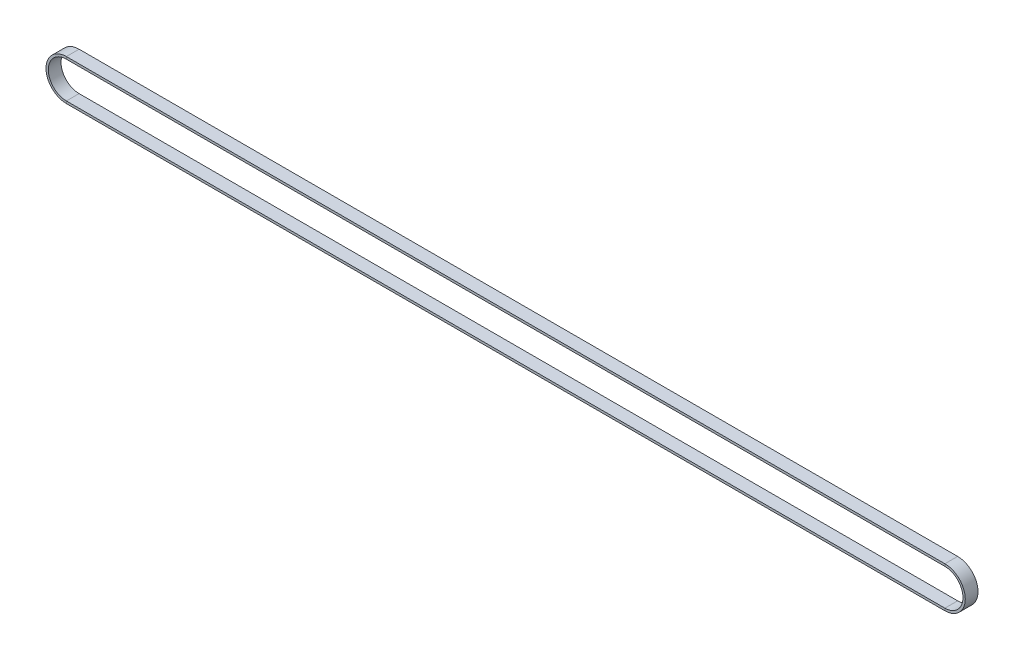
ISO-10303-21;
HEADER;
FILE_DESCRIPTION(('STEP AP214'),'2;1');
FILE_NAME('part.step','',(''),(''),'','','');
FILE_SCHEMA(('AUTOMOTIVE_DESIGN { 1 0 10303 214 1 1 1 1 }'));
ENDSEC;
DATA;
#1=APPLICATION_CONTEXT('core data for automotive mechanical design processes');
#2=APPLICATION_PROTOCOL_DEFINITION('international standard','automotive_design',2000,#1);
#3=PRODUCT_CONTEXT('',#1,'mechanical');
#4=PRODUCT('Part','Part','',(#3));
#5=PRODUCT_RELATED_PRODUCT_CATEGORY('part','',(#4));
#6=PRODUCT_DEFINITION_FORMATION('','',#4);
#7=PRODUCT_DEFINITION_CONTEXT('part definition',#1,'design');
#8=PRODUCT_DEFINITION('design','',#6,#7);
#9=PRODUCT_DEFINITION_SHAPE('','',#8);
#10=(LENGTH_UNIT() NAMED_UNIT(*) SI_UNIT(.MILLI.,.METRE.));
#11=(NAMED_UNIT(*) PLANE_ANGLE_UNIT() SI_UNIT($,.RADIAN.));
#12=(NAMED_UNIT(*) SI_UNIT($,.STERADIAN.) SOLID_ANGLE_UNIT());
#13=UNCERTAINTY_MEASURE_WITH_UNIT(LENGTH_MEASURE(1.E-05),#10,'distance_accuracy_value','');
#14=(GEOMETRIC_REPRESENTATION_CONTEXT(3) GLOBAL_UNCERTAINTY_ASSIGNED_CONTEXT((#13)) GLOBAL_UNIT_ASSIGNED_CONTEXT((#10,
#11,#12)) REPRESENTATION_CONTEXT('',''));
#15=CARTESIAN_POINT('',(0.,0.,0.));
#16=DIRECTION('',(0.,0.,1.));
#17=DIRECTION('',(1.,0.,0.));
#18=AXIS2_PLACEMENT_3D('',#15,#16,#17);
#19=CARTESIAN_POINT('',(438.15,10.1600000000001,-3.175));
#20=DIRECTION('',(0.,-1.,0.));
#21=DIRECTION('',(0.,0.,-1.));
#22=AXIS2_PLACEMENT_3D('',#19,#20,#21);
#23=PLANE('',#22);
#24=DIRECTION('',(0.,0.,1.));
#25=VECTOR('',#24,1.);
#26=CARTESIAN_POINT('',(438.15,10.16,-3.175));
#27=LINE('',#26,#25);
#28=CARTESIAN_POINT('',(438.15,10.16,-3.175));
#29=VERTEX_POINT('',#28);
#30=CARTESIAN_POINT('',(438.15,10.16,3.175));
#31=VERTEX_POINT('',#30);
#32=EDGE_CURVE('E155',#29,#31,#27,.T.);
#33=ORIENTED_EDGE('',*,*,#32,.F.);
#34=DIRECTION('',(-1.,0.,0.));
#35=VECTOR('',#34,1.);
#36=CARTESIAN_POINT('',(438.15,10.1600000000001,-3.175));
#37=LINE('',#36,#35);
#38=CARTESIAN_POINT('',(0.,10.16,-3.175));
#39=VERTEX_POINT('',#38);
#40=EDGE_CURVE('E154',#29,#39,#37,.T.);
#41=ORIENTED_EDGE('',*,*,#40,.T.);
#42=DIRECTION('',(0.,0.,1.));
#43=VECTOR('',#42,1.);
#44=CARTESIAN_POINT('',(0.,10.16,-3.175));
#45=LINE('',#44,#43);
#46=CARTESIAN_POINT('',(0.,10.16,3.175));
#47=VERTEX_POINT('',#46);
#48=EDGE_CURVE('E133',#39,#47,#45,.T.);
#49=ORIENTED_EDGE('',*,*,#48,.T.);
#50=DIRECTION('',(-1.,0.,0.));
#51=VECTOR('',#50,1.);
#52=CARTESIAN_POINT('',(438.15,10.1600000000001,3.175));
#53=LINE('',#52,#51);
#54=EDGE_CURVE('E159',#31,#47,#53,.T.);
#55=ORIENTED_EDGE('',*,*,#54,.F.);
#56=EDGE_LOOP('',(#33,#41,#49,#55));
#57=FACE_BOUND('',#56,.T.);
#58=ADVANCED_FACE('F39',(#57),#23,.F.);
#59=CARTESIAN_POINT('',(0.,0.,0.));
#60=DIRECTION('',(0.,0.,1.));
#61=DIRECTION('',(1.,0.,0.));
#62=AXIS2_PLACEMENT_3D('',#59,#60,#61);
#63=CYLINDRICAL_SURFACE('',#62,10.16);
#64=CARTESIAN_POINT('',(0.,0.,3.175));
#65=DIRECTION('',(0.,0.,1.));
#66=DIRECTION('',(0.,1.,0.));
#67=AXIS2_PLACEMENT_3D('',#64,#65,#66);
#68=CIRCLE('',#67,10.16);
#69=CARTESIAN_POINT('',(0.,-10.16,3.175));
#70=VERTEX_POINT('',#69);
#71=EDGE_CURVE('E123',#47,#70,#68,.T.);
#72=ORIENTED_EDGE('',*,*,#71,.F.);
#73=ORIENTED_EDGE('',*,*,#48,.F.);
#74=CARTESIAN_POINT('',(0.,0.,-3.175));
#75=DIRECTION('',(0.,0.,1.));
#76=DIRECTION('',(0.,1.,0.));
#77=AXIS2_PLACEMENT_3D('',#74,#75,#76);
#78=CIRCLE('',#77,10.16);
#79=CARTESIAN_POINT('',(0.,-10.16,-3.175));
#80=VERTEX_POINT('',#79);
#81=EDGE_CURVE('E136',#39,#80,#78,.T.);
#82=ORIENTED_EDGE('',*,*,#81,.T.);
#83=DIRECTION('',(0.,0.,1.));
#84=VECTOR('',#83,1.);
#85=CARTESIAN_POINT('',(0.,-10.16,-3.175));
#86=LINE('',#85,#84);
#87=EDGE_CURVE('E151',#80,#70,#86,.T.);
#88=ORIENTED_EDGE('',*,*,#87,.T.);
#89=EDGE_LOOP('',(#72,#73,#82,#88));
#90=FACE_BOUND('',#89,.T.);
#91=ADVANCED_FACE('F135',(#90),#63,.T.);
#92=CARTESIAN_POINT('',(0.,9.017,3.175));
#93=DIRECTION('',(0.,0.,-1.));
#94=DIRECTION('',(-1.,0.,0.));
#95=AXIS2_PLACEMENT_3D('',#92,#93,#94);
#96=PLANE('',#95);
#97=CARTESIAN_POINT('',(0.,0.,3.175));
#98=DIRECTION('',(0.,0.,1.));
#99=DIRECTION('',(0.,1.,0.));
#100=AXIS2_PLACEMENT_3D('',#97,#98,#99);
#101=CIRCLE('',#100,9.017);
#102=CARTESIAN_POINT('',(0.,9.017,3.175));
#103=VERTEX_POINT('',#102);
#104=CARTESIAN_POINT('',(0.,-9.017,3.175));
#105=VERTEX_POINT('',#104);
#106=EDGE_CURVE('E117',#103,#105,#101,.T.);
#107=ORIENTED_EDGE('',*,*,#106,.F.);
#108=DIRECTION('',(0.,-1.,0.));
#109=VECTOR('',#108,1.);
#110=CARTESIAN_POINT('',(0.,9.017,3.175));
#111=LINE('',#110,#109);
#112=EDGE_CURVE('E141',#47,#103,#111,.T.);
#113=ORIENTED_EDGE('',*,*,#112,.F.);
#114=ORIENTED_EDGE('',*,*,#71,.T.);
#115=DIRECTION('',(0.,1.,0.));
#116=VECTOR('',#115,1.);
#117=CARTESIAN_POINT('',(0.,-9.017,3.175));
#118=LINE('',#117,#116);
#119=EDGE_CURVE('E199',#70,#105,#118,.T.);
#120=ORIENTED_EDGE('',*,*,#119,.T.);
#121=EDGE_LOOP('',(#107,#113,#114,#120));
#122=FACE_BOUND('',#121,.T.);
#123=ADVANCED_FACE('F218',(#122),#96,.F.);
#124=CARTESIAN_POINT('',(0.,0.,0.));
#125=DIRECTION('',(0.,0.,1.));
#126=DIRECTION('',(1.,0.,0.));
#127=AXIS2_PLACEMENT_3D('',#124,#125,#126);
#128=CYLINDRICAL_SURFACE('',#127,9.017);
#129=CARTESIAN_POINT('',(0.,0.,-3.175));
#130=DIRECTION('',(0.,0.,1.));
#131=DIRECTION('',(0.,1.,0.));
#132=AXIS2_PLACEMENT_3D('',#129,#130,#131);
#133=CIRCLE('',#132,9.017);
#134=CARTESIAN_POINT('',(0.,9.017,-3.175));
#135=VERTEX_POINT('',#134);
#136=CARTESIAN_POINT('',(0.,-9.017,-3.175));
#137=VERTEX_POINT('',#136);
#138=EDGE_CURVE('E169',#135,#137,#133,.T.);
#139=ORIENTED_EDGE('',*,*,#138,.F.);
#140=DIRECTION('',(0.,0.,-1.));
#141=VECTOR('',#140,1.);
#142=CARTESIAN_POINT('',(0.,9.017,3.175));
#143=LINE('',#142,#141);
#144=EDGE_CURVE('E162',#103,#135,#143,.T.);
#145=ORIENTED_EDGE('',*,*,#144,.F.);
#146=ORIENTED_EDGE('',*,*,#106,.T.);
#147=DIRECTION('',(0.,0.,-1.));
#148=VECTOR('',#147,1.);
#149=CARTESIAN_POINT('',(0.,-9.017,3.175));
#150=LINE('',#149,#148);
#151=EDGE_CURVE('E187',#105,#137,#150,.T.);
#152=ORIENTED_EDGE('',*,*,#151,.T.);
#153=EDGE_LOOP('',(#139,#145,#146,#152));
#154=FACE_BOUND('',#153,.T.);
#155=ADVANCED_FACE('F186',(#154),#128,.F.);
#156=CARTESIAN_POINT('',(0.,9.017,-3.175));
#157=DIRECTION('',(0.,0.,1.));
#158=DIRECTION('',(1.,0.,0.));
#159=AXIS2_PLACEMENT_3D('',#156,#157,#158);
#160=PLANE('',#159);
#161=DIRECTION('',(0.,-1.,0.));
#162=VECTOR('',#161,1.);
#163=CARTESIAN_POINT('',(0.,-9.017,-3.175));
#164=LINE('',#163,#162);
#165=EDGE_CURVE('E149',#137,#80,#164,.T.);
#166=ORIENTED_EDGE('',*,*,#165,.T.);
#167=ORIENTED_EDGE('',*,*,#81,.F.);
#168=DIRECTION('',(0.,1.,0.));
#169=VECTOR('',#168,1.);
#170=CARTESIAN_POINT('',(0.,9.017,-3.175));
#171=LINE('',#170,#169);
#172=EDGE_CURVE('E148',#135,#39,#171,.T.);
#173=ORIENTED_EDGE('',*,*,#172,.F.);
#174=ORIENTED_EDGE('',*,*,#138,.T.);
#175=EDGE_LOOP('',(#166,#167,#173,#174));
#176=FACE_BOUND('',#175,.T.);
#177=ADVANCED_FACE('F146',(#176),#160,.F.);
#178=CARTESIAN_POINT('',(0.,-10.16,-3.175));
#179=DIRECTION('',(0.,1.,0.));
#180=DIRECTION('',(0.,0.,1.));
#181=AXIS2_PLACEMENT_3D('',#178,#179,#180);
#182=PLANE('',#181);
#183=DIRECTION('',(1.,0.,0.));
#184=VECTOR('',#183,1.);
#185=CARTESIAN_POINT('',(0.,-10.16,3.175));
#186=LINE('',#185,#184);
#187=CARTESIAN_POINT('',(438.15,-10.1599999999999,3.175));
#188=VERTEX_POINT('',#187);
#189=EDGE_CURVE('E104',#70,#188,#186,.T.);
#190=ORIENTED_EDGE('',*,*,#189,.F.);
#191=ORIENTED_EDGE('',*,*,#87,.F.);
#192=DIRECTION('',(1.,0.,0.));
#193=VECTOR('',#192,1.);
#194=CARTESIAN_POINT('',(0.,-10.16,-3.175));
#195=LINE('',#194,#193);
#196=CARTESIAN_POINT('',(438.15,-10.1599999999999,-3.175));
#197=VERTEX_POINT('',#196);
#198=EDGE_CURVE('E168',#80,#197,#195,.T.);
#199=ORIENTED_EDGE('',*,*,#198,.T.);
#200=DIRECTION('',(0.,0.,1.));
#201=VECTOR('',#200,1.);
#202=CARTESIAN_POINT('',(438.15,-10.1599999999999,-3.175));
#203=LINE('',#202,#201);
#204=EDGE_CURVE('E209',#197,#188,#203,.T.);
#205=ORIENTED_EDGE('',*,*,#204,.T.);
#206=EDGE_LOOP('',(#190,#191,#199,#205));
#207=FACE_BOUND('',#206,.T.);
#208=ADVANCED_FACE('F214',(#207),#182,.F.);
#209=CARTESIAN_POINT('',(0.,-9.017,3.175));
#210=DIRECTION('',(0.,0.,-1.));
#211=DIRECTION('',(0.,1.,0.));
#212=AXIS2_PLACEMENT_3D('',#209,#210,#211);
#213=PLANE('',#212);
#214=DIRECTION('',(1.,0.,0.));
#215=VECTOR('',#214,1.);
#216=CARTESIAN_POINT('',(0.,-9.017,3.175));
#217=LINE('',#216,#215);
#218=CARTESIAN_POINT('',(438.15,-9.01699999999995,3.175));
#219=VERTEX_POINT('',#218);
#220=EDGE_CURVE('E97',#105,#219,#217,.T.);
#221=ORIENTED_EDGE('',*,*,#220,.F.);
#222=ORIENTED_EDGE('',*,*,#119,.F.);
#223=ORIENTED_EDGE('',*,*,#189,.T.);
#224=DIRECTION('',(0.,1.,0.));
#225=VECTOR('',#224,1.);
#226=CARTESIAN_POINT('',(438.15,-9.01699999999995,3.175));
#227=LINE('',#226,#225);
#228=EDGE_CURVE('E196',#188,#219,#227,.T.);
#229=ORIENTED_EDGE('',*,*,#228,.T.);
#230=EDGE_LOOP('',(#221,#222,#223,#229));
#231=FACE_BOUND('',#230,.T.);
#232=ADVANCED_FACE('F217',(#231),#213,.F.);
#233=CARTESIAN_POINT('',(0.,-9.017,3.175));
#234=DIRECTION('',(0.,-1.,0.));
#235=DIRECTION('',(1.,0.,0.));
#236=AXIS2_PLACEMENT_3D('',#233,#234,#235);
#237=PLANE('',#236);
#238=DIRECTION('',(1.,0.,0.));
#239=VECTOR('',#238,1.);
#240=CARTESIAN_POINT('',(0.,-9.017,-3.175));
#241=LINE('',#240,#239);
#242=CARTESIAN_POINT('',(438.15,-9.01699999999995,-3.175));
#243=VERTEX_POINT('',#242);
#244=EDGE_CURVE('E88',#137,#243,#241,.T.);
#245=ORIENTED_EDGE('',*,*,#244,.F.);
#246=ORIENTED_EDGE('',*,*,#151,.F.);
#247=ORIENTED_EDGE('',*,*,#220,.T.);
#248=DIRECTION('',(0.,0.,-1.));
#249=VECTOR('',#248,1.);
#250=CARTESIAN_POINT('',(438.15,-9.01699999999995,3.175));
#251=LINE('',#250,#249);
#252=EDGE_CURVE('E174',#219,#243,#251,.T.);
#253=ORIENTED_EDGE('',*,*,#252,.T.);
#254=EDGE_LOOP('',(#245,#246,#247,#253));
#255=FACE_BOUND('',#254,.T.);
#256=ADVANCED_FACE('F236',(#255),#237,.F.);
#257=CARTESIAN_POINT('',(0.,-9.017,-3.175));
#258=DIRECTION('',(0.,0.,1.));
#259=DIRECTION('',(0.,-1.,0.));
#260=AXIS2_PLACEMENT_3D('',#257,#258,#259);
#261=PLANE('',#260);
#262=DIRECTION('',(0.,-1.,0.));
#263=VECTOR('',#262,1.);
#264=CARTESIAN_POINT('',(438.15,-9.01699999999995,-3.175));
#265=LINE('',#264,#263);
#266=EDGE_CURVE('E170',#243,#197,#265,.T.);
#267=ORIENTED_EDGE('',*,*,#266,.T.);
#268=ORIENTED_EDGE('',*,*,#198,.F.);
#269=ORIENTED_EDGE('',*,*,#165,.F.);
#270=ORIENTED_EDGE('',*,*,#244,.T.);
#271=EDGE_LOOP('',(#267,#268,#269,#270));
#272=FACE_BOUND('',#271,.T.);
#273=ADVANCED_FACE('F228',(#272),#261,.F.);
#274=CARTESIAN_POINT('',(438.15,0.,0.));
#275=DIRECTION('',(0.,0.,1.));
#276=DIRECTION('',(1.,0.,0.));
#277=AXIS2_PLACEMENT_3D('',#274,#275,#276);
#278=CYLINDRICAL_SURFACE('',#277,10.16);
#279=CARTESIAN_POINT('',(438.15,0.,3.175));
#280=DIRECTION('',(0.,0.,1.));
#281=DIRECTION('',(0.,-1.,0.));
#282=AXIS2_PLACEMENT_3D('',#279,#280,#281);
#283=CIRCLE('',#282,10.16);
#284=EDGE_CURVE('E194',#188,#31,#283,.T.);
#285=ORIENTED_EDGE('',*,*,#284,.F.);
#286=ORIENTED_EDGE('',*,*,#204,.F.);
#287=CARTESIAN_POINT('',(438.15,0.,-3.175));
#288=DIRECTION('',(0.,0.,1.));
#289=DIRECTION('',(0.,-1.,0.));
#290=AXIS2_PLACEMENT_3D('',#287,#288,#289);
#291=CIRCLE('',#290,10.16);
#292=EDGE_CURVE('E171',#197,#29,#291,.T.);
#293=ORIENTED_EDGE('',*,*,#292,.T.);
#294=ORIENTED_EDGE('',*,*,#32,.T.);
#295=EDGE_LOOP('',(#285,#286,#293,#294));
#296=FACE_BOUND('',#295,.T.);
#297=ADVANCED_FACE('F226',(#296),#278,.T.);
#298=CARTESIAN_POINT('',(438.15,-9.01700000000003,3.175));
#299=DIRECTION('',(0.,0.,-1.));
#300=DIRECTION('',(-1.,0.,0.));
#301=AXIS2_PLACEMENT_3D('',#298,#299,#300);
#302=PLANE('',#301);
#303=CARTESIAN_POINT('',(438.15,0.,3.175));
#304=DIRECTION('',(0.,0.,1.));
#305=DIRECTION('',(0.,-1.,0.));
#306=AXIS2_PLACEMENT_3D('',#303,#304,#305);
#307=CIRCLE('',#306,9.01700000000003);
#308=CARTESIAN_POINT('',(438.15,9.01700000000003,3.175));
#309=VERTEX_POINT('',#308);
#310=EDGE_CURVE('E64',#219,#309,#307,.T.);
#311=ORIENTED_EDGE('',*,*,#310,.F.);
#312=ORIENTED_EDGE('',*,*,#228,.F.);
#313=ORIENTED_EDGE('',*,*,#284,.T.);
#314=DIRECTION('',(0.,-1.,0.));
#315=VECTOR('',#314,1.);
#316=CARTESIAN_POINT('',(438.15,9.01700000000003,3.175));
#317=LINE('',#316,#315);
#318=EDGE_CURVE('E192',#31,#309,#317,.T.);
#319=ORIENTED_EDGE('',*,*,#318,.T.);
#320=EDGE_LOOP('',(#311,#312,#313,#319));
#321=FACE_BOUND('',#320,.T.);
#322=ADVANCED_FACE('F223',(#321),#302,.F.);
#323=CARTESIAN_POINT('',(438.15,0.,0.));
#324=DIRECTION('',(0.,0.,1.));
#325=DIRECTION('',(1.,0.,0.));
#326=AXIS2_PLACEMENT_3D('',#323,#324,#325);
#327=CYLINDRICAL_SURFACE('',#326,9.01700000000003);
#328=CARTESIAN_POINT('',(438.15,0.,-3.175));
#329=DIRECTION('',(0.,0.,1.));
#330=DIRECTION('',(0.,-1.,0.));
#331=AXIS2_PLACEMENT_3D('',#328,#329,#330);
#332=CIRCLE('',#331,9.01700000000003);
#333=CARTESIAN_POINT('',(438.15,9.01700000000003,-3.175));
#334=VERTEX_POINT('',#333);
#335=EDGE_CURVE('E56',#243,#334,#332,.T.);
#336=ORIENTED_EDGE('',*,*,#335,.F.);
#337=ORIENTED_EDGE('',*,*,#252,.F.);
#338=ORIENTED_EDGE('',*,*,#310,.T.);
#339=DIRECTION('',(0.,0.,-1.));
#340=VECTOR('',#339,1.);
#341=CARTESIAN_POINT('',(438.15,9.01700000000003,3.175));
#342=LINE('',#341,#340);
#343=EDGE_CURVE('E179',#309,#334,#342,.T.);
#344=ORIENTED_EDGE('',*,*,#343,.T.);
#345=EDGE_LOOP('',(#336,#337,#338,#344));
#346=FACE_BOUND('',#345,.T.);
#347=ADVANCED_FACE('F234',(#346),#327,.F.);
#348=CARTESIAN_POINT('',(438.15,-9.01700000000003,-3.175));
#349=DIRECTION('',(0.,0.,1.));
#350=DIRECTION('',(1.,0.,0.));
#351=AXIS2_PLACEMENT_3D('',#348,#349,#350);
#352=PLANE('',#351);
#353=DIRECTION('',(0.,1.,0.));
#354=VECTOR('',#353,1.);
#355=CARTESIAN_POINT('',(438.15,9.01700000000003,-3.175));
#356=LINE('',#355,#354);
#357=EDGE_CURVE('E43',#334,#29,#356,.T.);
#358=ORIENTED_EDGE('',*,*,#357,.T.);
#359=ORIENTED_EDGE('',*,*,#292,.F.);
#360=ORIENTED_EDGE('',*,*,#266,.F.);
#361=ORIENTED_EDGE('',*,*,#335,.T.);
#362=EDGE_LOOP('',(#358,#359,#360,#361));
#363=FACE_BOUND('',#362,.T.);
#364=ADVANCED_FACE('F180',(#363),#352,.F.);
#365=CARTESIAN_POINT('',(438.15,9.01700000000011,3.175));
#366=DIRECTION('',(0.,0.,-1.));
#367=DIRECTION('',(0.,1.,0.));
#368=AXIS2_PLACEMENT_3D('',#365,#366,#367);
#369=PLANE('',#368);
#370=ORIENTED_EDGE('',*,*,#54,.T.);
#371=ORIENTED_EDGE('',*,*,#112,.T.);
#372=DIRECTION('',(-1.,0.,0.));
#373=VECTOR('',#372,1.);
#374=CARTESIAN_POINT('',(438.15,9.01700000000011,3.175));
#375=LINE('',#374,#373);
#376=EDGE_CURVE('E48',#309,#103,#375,.T.);
#377=ORIENTED_EDGE('',*,*,#376,.F.);
#378=ORIENTED_EDGE('',*,*,#318,.F.);
#379=EDGE_LOOP('',(#370,#371,#377,#378));
#380=FACE_BOUND('',#379,.T.);
#381=ADVANCED_FACE('F220',(#380),#369,.F.);
#382=CARTESIAN_POINT('',(438.15,9.01700000000011,3.175));
#383=DIRECTION('',(0.,1.,0.));
#384=DIRECTION('',(-1.,0.,0.));
#385=AXIS2_PLACEMENT_3D('',#382,#383,#384);
#386=PLANE('',#385);
#387=ORIENTED_EDGE('',*,*,#376,.T.);
#388=ORIENTED_EDGE('',*,*,#144,.T.);
#389=DIRECTION('',(-1.,0.,0.));
#390=VECTOR('',#389,1.);
#391=CARTESIAN_POINT('',(438.15,9.01700000000011,-3.175));
#392=LINE('',#391,#390);
#393=EDGE_CURVE('E11',#334,#135,#392,.T.);
#394=ORIENTED_EDGE('',*,*,#393,.F.);
#395=ORIENTED_EDGE('',*,*,#343,.F.);
#396=EDGE_LOOP('',(#387,#388,#394,#395));
#397=FACE_BOUND('',#396,.T.);
#398=ADVANCED_FACE('F184',(#397),#386,.F.);
#399=CARTESIAN_POINT('',(438.15,9.01700000000011,-3.175));
#400=DIRECTION('',(0.,0.,1.));
#401=DIRECTION('',(0.,-1.,0.));
#402=AXIS2_PLACEMENT_3D('',#399,#400,#401);
#403=PLANE('',#402);
#404=ORIENTED_EDGE('',*,*,#393,.T.);
#405=ORIENTED_EDGE('',*,*,#172,.T.);
#406=ORIENTED_EDGE('',*,*,#40,.F.);
#407=ORIENTED_EDGE('',*,*,#357,.F.);
#408=EDGE_LOOP('',(#404,#405,#406,#407));
#409=FACE_BOUND('',#408,.T.);
#410=ADVANCED_FACE('F41',(#409),#403,.F.);
#411=CLOSED_SHELL('',(#58,#91,#123,#155,#177,#208,#232,#256,#273,#297,#322,#347,#364,#381,#398,#410));
#412=MANIFOLD_SOLID_BREP('B2',#411);
#413=ADVANCED_BREP_SHAPE_REPRESENTATION('',(#18,#412),#14);
#414=SHAPE_DEFINITION_REPRESENTATION(#9,#413);
ENDSEC;
END-ISO-10303-21;
